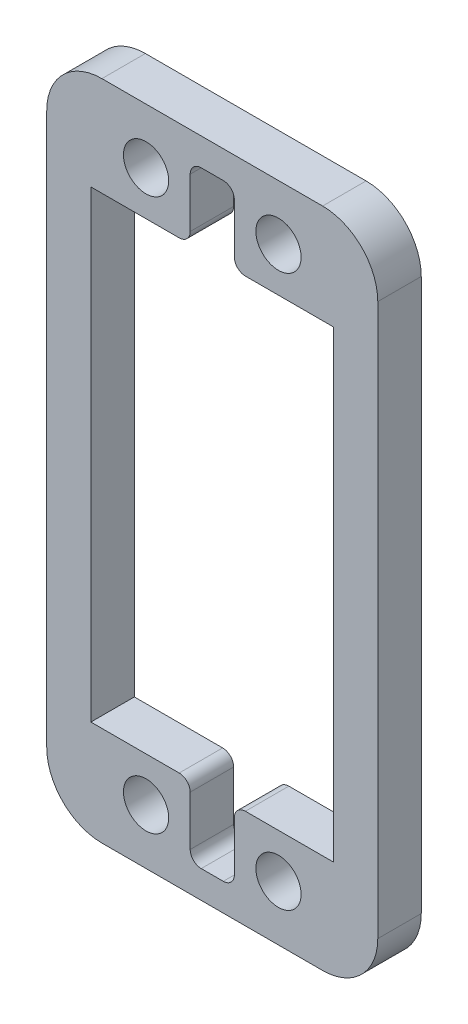
ISO-10303-21;
HEADER;
FILE_DESCRIPTION(('STEP AP214'),'2;1');
FILE_NAME('part.step','',(''),(''),'','','');
FILE_SCHEMA(('AUTOMOTIVE_DESIGN { 1 0 10303 214 1 1 1 1 }'));
ENDSEC;
DATA;
#1=APPLICATION_CONTEXT('core data for automotive mechanical design processes');
#2=APPLICATION_PROTOCOL_DEFINITION('international standard','automotive_design',2000,#1);
#3=PRODUCT_CONTEXT('',#1,'mechanical');
#4=PRODUCT('Part','Part','',(#3));
#5=PRODUCT_RELATED_PRODUCT_CATEGORY('part','',(#4));
#6=PRODUCT_DEFINITION_FORMATION('','',#4);
#7=PRODUCT_DEFINITION_CONTEXT('part definition',#1,'design');
#8=PRODUCT_DEFINITION('design','',#6,#7);
#9=PRODUCT_DEFINITION_SHAPE('','',#8);
#10=(LENGTH_UNIT() NAMED_UNIT(*) SI_UNIT(.MILLI.,.METRE.));
#11=(NAMED_UNIT(*) PLANE_ANGLE_UNIT() SI_UNIT($,.RADIAN.));
#12=(NAMED_UNIT(*) SI_UNIT($,.STERADIAN.) SOLID_ANGLE_UNIT());
#13=UNCERTAINTY_MEASURE_WITH_UNIT(LENGTH_MEASURE(1.E-05),#10,'distance_accuracy_value','');
#14=(GEOMETRIC_REPRESENTATION_CONTEXT(3) GLOBAL_UNCERTAINTY_ASSIGNED_CONTEXT((#13)) GLOBAL_UNIT_ASSIGNED_CONTEXT((#10,
#11,#12)) REPRESENTATION_CONTEXT('',''));
#15=CARTESIAN_POINT('',(0.,0.,0.));
#16=DIRECTION('',(0.,0.,1.));
#17=DIRECTION('',(1.,0.,0.));
#18=AXIS2_PLACEMENT_3D('',#15,#16,#17);
#19=CARTESIAN_POINT('',(11.,21.,3.94));
#20=DIRECTION('',(0.,1.,0.));
#21=DIRECTION('',(0.,0.,1.));
#22=AXIS2_PLACEMENT_3D('',#19,#20,#21);
#23=PLANE('',#22);
#24=DIRECTION('',(1.,0.,0.));
#25=VECTOR('',#24,1.);
#26=CARTESIAN_POINT('',(11.,21.,0.));
#27=LINE('',#26,#25);
#28=CARTESIAN_POINT('',(-11.,21.,0.));
#29=VERTEX_POINT('',#28);
#30=CARTESIAN_POINT('',(-3.,21.,0.));
#31=VERTEX_POINT('',#30);
#32=EDGE_CURVE('E252',#29,#31,#27,.T.);
#33=ORIENTED_EDGE('',*,*,#32,.T.);
#34=DIRECTION('',(0.,0.,1.));
#35=VECTOR('',#34,1.);
#36=CARTESIAN_POINT('',(-3.,21.,3.94));
#37=LINE('',#36,#35);
#38=CARTESIAN_POINT('',(-3.,21.,3.94));
#39=VERTEX_POINT('',#38);
#40=EDGE_CURVE('E388',#31,#39,#37,.T.);
#41=ORIENTED_EDGE('',*,*,#40,.T.);
#42=DIRECTION('',(1.,0.,0.));
#43=VECTOR('',#42,1.);
#44=CARTESIAN_POINT('',(11.,21.,3.94));
#45=LINE('',#44,#43);
#46=CARTESIAN_POINT('',(-11.,21.,3.94));
#47=VERTEX_POINT('',#46);
#48=EDGE_CURVE('E236',#47,#39,#45,.T.);
#49=ORIENTED_EDGE('',*,*,#48,.F.);
#50=DIRECTION('',(0.,0.,-1.));
#51=VECTOR('',#50,1.);
#52=CARTESIAN_POINT('',(-11.,21.,3.94));
#53=LINE('',#52,#51);
#54=EDGE_CURVE('E276',#47,#29,#53,.T.);
#55=ORIENTED_EDGE('',*,*,#54,.T.);
#56=EDGE_LOOP('',(#33,#41,#49,#55));
#57=FACE_BOUND('',#56,.T.);
#58=ADVANCED_FACE('F39',(#57),#23,.F.);
#59=CARTESIAN_POINT('',(-11.,-21.,3.94));
#60=DIRECTION('',(0.,-1.,0.));
#61=DIRECTION('',(0.,0.,-1.));
#62=AXIS2_PLACEMENT_3D('',#59,#60,#61);
#63=PLANE('',#62);
#64=DIRECTION('',(-1.,0.,0.));
#65=VECTOR('',#64,1.);
#66=CARTESIAN_POINT('',(-11.,-21.,3.94));
#67=LINE('',#66,#65);
#68=CARTESIAN_POINT('',(-3.00000000000001,-21.,3.94));
#69=VERTEX_POINT('',#68);
#70=CARTESIAN_POINT('',(-11.,-21.,3.94));
#71=VERTEX_POINT('',#70);
#72=EDGE_CURVE('E244',#69,#71,#67,.T.);
#73=ORIENTED_EDGE('',*,*,#72,.F.);
#74=DIRECTION('',(0.,0.,-1.));
#75=VECTOR('',#74,1.);
#76=CARTESIAN_POINT('',(-3.00000000000001,-21.,3.94));
#77=LINE('',#76,#75);
#78=CARTESIAN_POINT('',(-3.00000000000001,-21.,0.));
#79=VERTEX_POINT('',#78);
#80=EDGE_CURVE('E349',#69,#79,#77,.T.);
#81=ORIENTED_EDGE('',*,*,#80,.T.);
#82=DIRECTION('',(-1.,0.,0.));
#83=VECTOR('',#82,1.);
#84=CARTESIAN_POINT('',(-11.,-21.,0.));
#85=LINE('',#84,#83);
#86=CARTESIAN_POINT('',(-11.,-21.,0.));
#87=VERTEX_POINT('',#86);
#88=EDGE_CURVE('E266',#79,#87,#85,.T.);
#89=ORIENTED_EDGE('',*,*,#88,.T.);
#90=DIRECTION('',(0.,0.,-1.));
#91=VECTOR('',#90,1.);
#92=CARTESIAN_POINT('',(-11.,-21.,3.94));
#93=LINE('',#92,#91);
#94=EDGE_CURVE('E235',#71,#87,#93,.T.);
#95=ORIENTED_EDGE('',*,*,#94,.F.);
#96=EDGE_LOOP('',(#73,#81,#89,#95));
#97=FACE_BOUND('',#96,.T.);
#98=ADVANCED_FACE('F515',(#97),#63,.F.);
#99=CARTESIAN_POINT('',(-15.,-30.,3.94));
#100=DIRECTION('',(1.,0.,0.));
#101=DIRECTION('',(0.,0.,-1.));
#102=AXIS2_PLACEMENT_3D('',#99,#100,#101);
#103=PLANE('',#102);
#104=DIRECTION('',(0.,-1.,0.));
#105=VECTOR('',#104,1.);
#106=CARTESIAN_POINT('',(-15.,-30.,0.));
#107=LINE('',#106,#105);
#108=CARTESIAN_POINT('',(-15.,25.,0.));
#109=VERTEX_POINT('',#108);
#110=CARTESIAN_POINT('',(-15.,-25.,0.));
#111=VERTEX_POINT('',#110);
#112=EDGE_CURVE('E275',#109,#111,#107,.T.);
#113=ORIENTED_EDGE('',*,*,#112,.T.);
#114=DIRECTION('',(0.,0.,-1.));
#115=VECTOR('',#114,1.);
#116=CARTESIAN_POINT('',(-15.,-25.,3.94));
#117=LINE('',#116,#115);
#118=CARTESIAN_POINT('',(-15.,-25.,3.94));
#119=VERTEX_POINT('',#118);
#120=EDGE_CURVE('E319',#111,#119,#117,.F.);
#121=ORIENTED_EDGE('',*,*,#120,.T.);
#122=DIRECTION('',(0.,-1.,0.));
#123=VECTOR('',#122,1.);
#124=CARTESIAN_POINT('',(-15.,-30.,3.94));
#125=LINE('',#124,#123);
#126=CARTESIAN_POINT('',(-15.,25.,3.94));
#127=VERTEX_POINT('',#126);
#128=EDGE_CURVE('E280',#127,#119,#125,.T.);
#129=ORIENTED_EDGE('',*,*,#128,.F.);
#130=DIRECTION('',(0.,0.,-1.));
#131=VECTOR('',#130,1.);
#132=CARTESIAN_POINT('',(-15.,25.,3.94));
#133=LINE('',#132,#131);
#134=EDGE_CURVE('E316',#127,#109,#133,.T.);
#135=ORIENTED_EDGE('',*,*,#134,.T.);
#136=EDGE_LOOP('',(#113,#121,#129,#135));
#137=FACE_BOUND('',#136,.T.);
#138=ADVANCED_FACE('F497',(#137),#103,.F.);
#139=CARTESIAN_POINT('',(15.,-30.,3.94));
#140=DIRECTION('',(0.,1.,0.));
#141=DIRECTION('',(0.,0.,1.));
#142=AXIS2_PLACEMENT_3D('',#139,#140,#141);
#143=PLANE('',#142);
#144=DIRECTION('',(1.,0.,0.));
#145=VECTOR('',#144,1.);
#146=CARTESIAN_POINT('',(15.,-30.,3.94));
#147=LINE('',#146,#145);
#148=CARTESIAN_POINT('',(-10.,-30.,3.94));
#149=VERTEX_POINT('',#148);
#150=CARTESIAN_POINT('',(10.,-30.,3.94));
#151=VERTEX_POINT('',#150);
#152=EDGE_CURVE('E283',#149,#151,#147,.T.);
#153=ORIENTED_EDGE('',*,*,#152,.F.);
#154=DIRECTION('',(0.,0.,-1.));
#155=VECTOR('',#154,1.);
#156=CARTESIAN_POINT('',(-10.,-30.,3.94));
#157=LINE('',#156,#155);
#158=CARTESIAN_POINT('',(-10.,-30.,0.));
#159=VERTEX_POINT('',#158);
#160=EDGE_CURVE('E305',#149,#159,#157,.T.);
#161=ORIENTED_EDGE('',*,*,#160,.T.);
#162=DIRECTION('',(1.,0.,0.));
#163=VECTOR('',#162,1.);
#164=CARTESIAN_POINT('',(15.,-30.,0.));
#165=LINE('',#164,#163);
#166=CARTESIAN_POINT('',(10.,-30.,0.));
#167=VERTEX_POINT('',#166);
#168=EDGE_CURVE('E296',#159,#167,#165,.T.);
#169=ORIENTED_EDGE('',*,*,#168,.T.);
#170=DIRECTION('',(0.,0.,-1.));
#171=VECTOR('',#170,1.);
#172=CARTESIAN_POINT('',(10.,-30.,3.94));
#173=LINE('',#172,#171);
#174=EDGE_CURVE('E293',#167,#151,#173,.F.);
#175=ORIENTED_EDGE('',*,*,#174,.T.);
#176=EDGE_LOOP('',(#153,#161,#169,#175));
#177=FACE_BOUND('',#176,.T.);
#178=ADVANCED_FACE('F470',(#177),#143,.F.);
#179=CARTESIAN_POINT('',(15.,30.,3.94));
#180=DIRECTION('',(-1.,0.,0.));
#181=DIRECTION('',(0.,-1.,0.));
#182=AXIS2_PLACEMENT_3D('',#179,#180,#181);
#183=PLANE('',#182);
#184=DIRECTION('',(0.,1.,0.));
#185=VECTOR('',#184,1.);
#186=CARTESIAN_POINT('',(15.,30.,3.94));
#187=LINE('',#186,#185);
#188=CARTESIAN_POINT('',(15.,-25.,3.94));
#189=VERTEX_POINT('',#188);
#190=CARTESIAN_POINT('',(15.,25.,3.94));
#191=VERTEX_POINT('',#190);
#192=EDGE_CURVE('E287',#189,#191,#187,.T.);
#193=ORIENTED_EDGE('',*,*,#192,.F.);
#194=DIRECTION('',(0.,0.,-1.));
#195=VECTOR('',#194,1.);
#196=CARTESIAN_POINT('',(15.,-25.,3.94));
#197=LINE('',#196,#195);
#198=CARTESIAN_POINT('',(15.,-25.,0.));
#199=VERTEX_POINT('',#198);
#200=EDGE_CURVE('E331',#189,#199,#197,.T.);
#201=ORIENTED_EDGE('',*,*,#200,.T.);
#202=DIRECTION('',(0.,1.,0.));
#203=VECTOR('',#202,1.);
#204=CARTESIAN_POINT('',(15.,30.,0.));
#205=LINE('',#204,#203);
#206=CARTESIAN_POINT('',(15.,25.,0.));
#207=VERTEX_POINT('',#206);
#208=EDGE_CURVE('E299',#199,#207,#205,.T.);
#209=ORIENTED_EDGE('',*,*,#208,.T.);
#210=DIRECTION('',(0.,0.,-1.));
#211=VECTOR('',#210,1.);
#212=CARTESIAN_POINT('',(15.,25.,3.94));
#213=LINE('',#212,#211);
#214=EDGE_CURVE('E329',#207,#191,#213,.F.);
#215=ORIENTED_EDGE('',*,*,#214,.T.);
#216=EDGE_LOOP('',(#193,#201,#209,#215));
#217=FACE_BOUND('',#216,.T.);
#218=ADVANCED_FACE('F480',(#217),#183,.F.);
#219=CARTESIAN_POINT('',(-15.,30.,3.94));
#220=DIRECTION('',(0.,-1.,0.));
#221=DIRECTION('',(0.,0.,-1.));
#222=AXIS2_PLACEMENT_3D('',#219,#220,#221);
#223=PLANE('',#222);
#224=DIRECTION('',(-1.,0.,0.));
#225=VECTOR('',#224,1.);
#226=CARTESIAN_POINT('',(-15.,30.,3.94));
#227=LINE('',#226,#225);
#228=CARTESIAN_POINT('',(9.99999999999999,30.,3.94));
#229=VERTEX_POINT('',#228);
#230=CARTESIAN_POINT('',(-10.,30.,3.94));
#231=VERTEX_POINT('',#230);
#232=EDGE_CURVE('E290',#229,#231,#227,.T.);
#233=ORIENTED_EDGE('',*,*,#232,.F.);
#234=DIRECTION('',(0.,0.,-1.));
#235=VECTOR('',#234,1.);
#236=CARTESIAN_POINT('',(10.,30.,3.94));
#237=LINE('',#236,#235);
#238=CARTESIAN_POINT('',(9.99999999999999,30.,0.));
#239=VERTEX_POINT('',#238);
#240=EDGE_CURVE('E336',#229,#239,#237,.T.);
#241=ORIENTED_EDGE('',*,*,#240,.T.);
#242=DIRECTION('',(-1.,0.,0.));
#243=VECTOR('',#242,1.);
#244=CARTESIAN_POINT('',(-15.,30.,0.));
#245=LINE('',#244,#243);
#246=CARTESIAN_POINT('',(-10.,30.,0.));
#247=VERTEX_POINT('',#246);
#248=EDGE_CURVE('E284',#239,#247,#245,.T.);
#249=ORIENTED_EDGE('',*,*,#248,.T.);
#250=DIRECTION('',(0.,0.,-1.));
#251=VECTOR('',#250,1.);
#252=CARTESIAN_POINT('',(-10.,30.,3.94));
#253=LINE('',#252,#251);
#254=EDGE_CURVE('E334',#247,#231,#253,.F.);
#255=ORIENTED_EDGE('',*,*,#254,.T.);
#256=EDGE_LOOP('',(#233,#241,#249,#255));
#257=FACE_BOUND('',#256,.T.);
#258=ADVANCED_FACE('F488',(#257),#223,.F.);
#259=CARTESIAN_POINT('',(0.,0.,3.94));
#260=DIRECTION('',(0.,0.,-1.));
#261=DIRECTION('',(-1.,0.,0.));
#262=AXIS2_PLACEMENT_3D('',#259,#260,#261);
#263=PLANE('',#262);
#264=CARTESIAN_POINT('',(-6.,25.,3.94));
#265=DIRECTION('',(0.,0.,-1.));
#266=DIRECTION('',(-1.,0.,0.));
#267=AXIS2_PLACEMENT_3D('',#264,#265,#266);
#268=CIRCLE('',#267,2.05);
#269=CARTESIAN_POINT('',(-8.05,25.,3.94));
#270=VERTEX_POINT('',#269);
#271=EDGE_CURVE('E445',#270,#270,#268,.T.);
#272=ORIENTED_EDGE('',*,*,#271,.T.);
#273=EDGE_LOOP('',(#272));
#274=FACE_BOUND('',#273,.T.);
#275=CARTESIAN_POINT('',(6.,-25.,3.94));
#276=DIRECTION('',(0.,0.,-1.));
#277=DIRECTION('',(-1.,0.,0.));
#278=AXIS2_PLACEMENT_3D('',#275,#276,#277);
#279=CIRCLE('',#278,2.05);
#280=CARTESIAN_POINT('',(3.95,-25.,3.94));
#281=VERTEX_POINT('',#280);
#282=EDGE_CURVE('E451',#281,#281,#279,.T.);
#283=ORIENTED_EDGE('',*,*,#282,.T.);
#284=EDGE_LOOP('',(#283));
#285=FACE_BOUND('',#284,.T.);
#286=CARTESIAN_POINT('',(-6.,-25.,3.94));
#287=DIRECTION('',(0.,0.,-1.));
#288=DIRECTION('',(-1.,0.,0.));
#289=AXIS2_PLACEMENT_3D('',#286,#287,#288);
#290=CIRCLE('',#289,2.05);
#291=CARTESIAN_POINT('',(-8.05,-25.,3.94));
#292=VERTEX_POINT('',#291);
#293=EDGE_CURVE('E849',#292,#292,#290,.T.);
#294=ORIENTED_EDGE('',*,*,#293,.T.);
#295=EDGE_LOOP('',(#294));
#296=FACE_BOUND('',#295,.T.);
#297=DIRECTION('',(0.,1.,0.));
#298=VECTOR('',#297,1.);
#299=CARTESIAN_POINT('',(-2.,27.5,3.94));
#300=LINE('',#299,#298);
#301=CARTESIAN_POINT('',(-2.00000000000001,-26.5,3.94));
#302=VERTEX_POINT('',#301);
#303=CARTESIAN_POINT('',(-2.00000000000001,-22.,3.94));
#304=VERTEX_POINT('',#303);
#305=EDGE_CURVE('E435',#302,#304,#300,.T.);
#306=ORIENTED_EDGE('',*,*,#305,.T.);
#307=CARTESIAN_POINT('',(-3.00000000000001,-22.,3.94));
#308=DIRECTION('',(0.,0.,-1.));
#309=DIRECTION('',(-1.,0.,0.));
#310=AXIS2_PLACEMENT_3D('',#307,#308,#309);
#311=CIRCLE('',#310,1.);
#312=EDGE_CURVE('E365',#304,#69,#311,.F.);
#313=ORIENTED_EDGE('',*,*,#312,.T.);
#314=ORIENTED_EDGE('',*,*,#72,.T.);
#315=DIRECTION('',(0.,1.,0.));
#316=VECTOR('',#315,1.);
#317=CARTESIAN_POINT('',(-11.,21.,3.94));
#318=LINE('',#317,#316);
#319=EDGE_CURVE('E243',#71,#47,#318,.T.);
#320=ORIENTED_EDGE('',*,*,#319,.T.);
#321=ORIENTED_EDGE('',*,*,#48,.T.);
#322=CARTESIAN_POINT('',(-3.,22.,3.94));
#323=DIRECTION('',(0.,0.,-1.));
#324=DIRECTION('',(-1.,0.,0.));
#325=AXIS2_PLACEMENT_3D('',#322,#323,#324);
#326=CIRCLE('',#325,1.);
#327=CARTESIAN_POINT('',(-2.,22.,3.94));
#328=VERTEX_POINT('',#327);
#329=EDGE_CURVE('E360',#39,#328,#326,.F.);
#330=ORIENTED_EDGE('',*,*,#329,.T.);
#331=CARTESIAN_POINT('',(-2.,26.5,3.94));
#332=VERTEX_POINT('',#331);
#333=EDGE_CURVE('E429',#328,#332,#300,.T.);
#334=ORIENTED_EDGE('',*,*,#333,.T.);
#335=CARTESIAN_POINT('',(-1.,26.5,3.94));
#336=DIRECTION('',(0.,0.,-1.));
#337=DIRECTION('',(-1.,0.,0.));
#338=AXIS2_PLACEMENT_3D('',#335,#336,#337);
#339=CIRCLE('',#338,1.);
#340=CARTESIAN_POINT('',(-1.,27.5,3.94));
#341=VERTEX_POINT('',#340);
#342=EDGE_CURVE('E11',#332,#341,#339,.T.);
#343=ORIENTED_EDGE('',*,*,#342,.T.);
#344=DIRECTION('',(1.,0.,0.));
#345=VECTOR('',#344,1.);
#346=CARTESIAN_POINT('',(2.,27.5,3.94));
#347=LINE('',#346,#345);
#348=CARTESIAN_POINT('',(1.,27.5,3.94));
#349=VERTEX_POINT('',#348);
#350=EDGE_CURVE('E427',#341,#349,#347,.T.);
#351=ORIENTED_EDGE('',*,*,#350,.T.);
#352=CARTESIAN_POINT('',(1.,26.5,3.94));
#353=DIRECTION('',(0.,0.,-1.));
#354=DIRECTION('',(-1.,0.,0.));
#355=AXIS2_PLACEMENT_3D('',#352,#353,#354);
#356=CIRCLE('',#355,1.);
#357=CARTESIAN_POINT('',(2.,26.5,3.94));
#358=VERTEX_POINT('',#357);
#359=EDGE_CURVE('E401',#349,#358,#356,.T.);
#360=ORIENTED_EDGE('',*,*,#359,.T.);
#361=DIRECTION('',(0.,-1.,0.));
#362=VECTOR('',#361,1.);
#363=CARTESIAN_POINT('',(2.,21.,3.94));
#364=LINE('',#363,#362);
#365=CARTESIAN_POINT('',(2.,22.,3.94));
#366=VERTEX_POINT('',#365);
#367=EDGE_CURVE('E433',#358,#366,#364,.T.);
#368=ORIENTED_EDGE('',*,*,#367,.T.);
#369=CARTESIAN_POINT('',(3.,22.,3.94));
#370=DIRECTION('',(0.,0.,-1.));
#371=DIRECTION('',(-1.,0.,0.));
#372=AXIS2_PLACEMENT_3D('',#369,#370,#371);
#373=CIRCLE('',#372,1.);
#374=CARTESIAN_POINT('',(3.,21.,3.94));
#375=VERTEX_POINT('',#374);
#376=EDGE_CURVE('E362',#366,#375,#373,.F.);
#377=ORIENTED_EDGE('',*,*,#376,.T.);
#378=CARTESIAN_POINT('',(11.,21.,3.94));
#379=VERTEX_POINT('',#378);
#380=EDGE_CURVE('E250',#375,#379,#45,.T.);
#381=ORIENTED_EDGE('',*,*,#380,.T.);
#382=DIRECTION('',(0.,-1.,0.));
#383=VECTOR('',#382,1.);
#384=CARTESIAN_POINT('',(11.,-21.,3.94));
#385=LINE('',#384,#383);
#386=CARTESIAN_POINT('',(11.,-21.,3.94));
#387=VERTEX_POINT('',#386);
#388=EDGE_CURVE('E229',#379,#387,#385,.T.);
#389=ORIENTED_EDGE('',*,*,#388,.T.);
#390=CARTESIAN_POINT('',(2.99999999999999,-21.,3.94));
#391=VERTEX_POINT('',#390);
#392=EDGE_CURVE('E239',#387,#391,#67,.T.);
#393=ORIENTED_EDGE('',*,*,#392,.T.);
#394=CARTESIAN_POINT('',(2.99999999999999,-22.,3.94));
#395=DIRECTION('',(0.,0.,-1.));
#396=DIRECTION('',(-1.,0.,0.));
#397=AXIS2_PLACEMENT_3D('',#394,#395,#396);
#398=CIRCLE('',#397,1.);
#399=CARTESIAN_POINT('',(2.,-22.,3.94));
#400=VERTEX_POINT('',#399);
#401=EDGE_CURVE('E61',#391,#400,#398,.F.);
#402=ORIENTED_EDGE('',*,*,#401,.T.);
#403=CARTESIAN_POINT('',(2.,-26.5,3.94));
#404=VERTEX_POINT('',#403);
#405=EDGE_CURVE('E438',#400,#404,#364,.T.);
#406=ORIENTED_EDGE('',*,*,#405,.T.);
#407=CARTESIAN_POINT('',(0.999999999999993,-26.5,3.94));
#408=DIRECTION('',(0.,0.,-1.));
#409=DIRECTION('',(-1.,0.,0.));
#410=AXIS2_PLACEMENT_3D('',#407,#408,#409);
#411=CIRCLE('',#410,1.);
#412=CARTESIAN_POINT('',(0.999999999999993,-27.5,3.94));
#413=VERTEX_POINT('',#412);
#414=EDGE_CURVE('E397',#404,#413,#411,.T.);
#415=ORIENTED_EDGE('',*,*,#414,.T.);
#416=DIRECTION('',(-1.,0.,0.));
#417=VECTOR('',#416,1.);
#418=CARTESIAN_POINT('',(-2.00000000000001,-27.5,3.94));
#419=LINE('',#418,#417);
#420=CARTESIAN_POINT('',(-1.00000000000001,-27.5,3.94));
#421=VERTEX_POINT('',#420);
#422=EDGE_CURVE('E556',#413,#421,#419,.T.);
#423=ORIENTED_EDGE('',*,*,#422,.T.);
#424=CARTESIAN_POINT('',(-1.00000000000001,-26.5,3.94));
#425=DIRECTION('',(0.,0.,-1.));
#426=DIRECTION('',(-1.,0.,0.));
#427=AXIS2_PLACEMENT_3D('',#424,#425,#426);
#428=CIRCLE('',#427,1.);
#429=EDGE_CURVE('E393',#421,#302,#428,.T.);
#430=ORIENTED_EDGE('',*,*,#429,.T.);
#431=EDGE_LOOP('',(#306,#313,#314,#320,#321,#330,#334,#343,#351,#360,#368,#377,#381,#389,#393,
#402,#406,#415,#423,#430));
#432=FACE_BOUND('',#431,.T.);
#433=CARTESIAN_POINT('',(6.,25.,3.94));
#434=DIRECTION('',(0.,0.,-1.));
#435=DIRECTION('',(-1.,0.,0.));
#436=AXIS2_PLACEMENT_3D('',#433,#434,#435);
#437=CIRCLE('',#436,2.05);
#438=CARTESIAN_POINT('',(3.95,25.,3.94));
#439=VERTEX_POINT('',#438);
#440=EDGE_CURVE('E267',#439,#439,#437,.T.);
#441=ORIENTED_EDGE('',*,*,#440,.T.);
#442=EDGE_LOOP('',(#441));
#443=FACE_BOUND('',#442,.T.);
#444=ORIENTED_EDGE('',*,*,#128,.T.);
#445=CARTESIAN_POINT('',(-10.,-25.,3.94));
#446=DIRECTION('',(0.,0.,-1.));
#447=DIRECTION('',(-1.,0.,0.));
#448=AXIS2_PLACEMENT_3D('',#445,#446,#447);
#449=CIRCLE('',#448,5.);
#450=EDGE_CURVE('E327',#119,#149,#449,.F.);
#451=ORIENTED_EDGE('',*,*,#450,.T.);
#452=ORIENTED_EDGE('',*,*,#152,.T.);
#453=CARTESIAN_POINT('',(10.,-25.,3.94));
#454=DIRECTION('',(0.,0.,-1.));
#455=DIRECTION('',(-1.,0.,0.));
#456=AXIS2_PLACEMENT_3D('',#453,#454,#455);
#457=CIRCLE('',#456,5.);
#458=EDGE_CURVE('E325',#151,#189,#457,.F.);
#459=ORIENTED_EDGE('',*,*,#458,.T.);
#460=ORIENTED_EDGE('',*,*,#192,.T.);
#461=CARTESIAN_POINT('',(10.,25.,3.94));
#462=DIRECTION('',(0.,0.,-1.));
#463=DIRECTION('',(-1.,0.,0.));
#464=AXIS2_PLACEMENT_3D('',#461,#462,#463);
#465=CIRCLE('',#464,5.);
#466=EDGE_CURVE('E323',#191,#229,#465,.F.);
#467=ORIENTED_EDGE('',*,*,#466,.T.);
#468=ORIENTED_EDGE('',*,*,#232,.T.);
#469=CARTESIAN_POINT('',(-10.,25.,3.94));
#470=DIRECTION('',(0.,0.,-1.));
#471=DIRECTION('',(-1.,0.,0.));
#472=AXIS2_PLACEMENT_3D('',#469,#470,#471);
#473=CIRCLE('',#472,5.);
#474=EDGE_CURVE('E321',#231,#127,#473,.F.);
#475=ORIENTED_EDGE('',*,*,#474,.T.);
#476=EDGE_LOOP('',(#444,#451,#452,#459,#460,#467,#468,#475));
#477=FACE_BOUND('',#476,.T.);
#478=ADVANCED_FACE('F247',(#274,#285,#296,#432,#443,#477),#263,.F.);
#479=CARTESIAN_POINT('',(0.,0.,0.));
#480=DIRECTION('',(0.,0.,-1.));
#481=DIRECTION('',(-1.,0.,0.));
#482=AXIS2_PLACEMENT_3D('',#479,#480,#481);
#483=PLANE('',#482);
#484=CARTESIAN_POINT('',(-6.,25.,0.));
#485=DIRECTION('',(0.,0.,-1.));
#486=DIRECTION('',(-1.,0.,0.));
#487=AXIS2_PLACEMENT_3D('',#484,#485,#486);
#488=CIRCLE('',#487,2.05);
#489=CARTESIAN_POINT('',(-8.05,25.,0.));
#490=VERTEX_POINT('',#489);
#491=EDGE_CURVE('E442',#490,#490,#488,.T.);
#492=ORIENTED_EDGE('',*,*,#491,.F.);
#493=EDGE_LOOP('',(#492));
#494=FACE_BOUND('',#493,.T.);
#495=CARTESIAN_POINT('',(6.,-25.,0.));
#496=DIRECTION('',(0.,0.,-1.));
#497=DIRECTION('',(-1.,0.,0.));
#498=AXIS2_PLACEMENT_3D('',#495,#496,#497);
#499=CIRCLE('',#498,2.05);
#500=CARTESIAN_POINT('',(3.95,-25.,0.));
#501=VERTEX_POINT('',#500);
#502=EDGE_CURVE('E448',#501,#501,#499,.T.);
#503=ORIENTED_EDGE('',*,*,#502,.F.);
#504=EDGE_LOOP('',(#503));
#505=FACE_BOUND('',#504,.T.);
#506=CARTESIAN_POINT('',(-6.,-25.,0.));
#507=DIRECTION('',(0.,0.,-1.));
#508=DIRECTION('',(-1.,0.,0.));
#509=AXIS2_PLACEMENT_3D('',#506,#507,#508);
#510=CIRCLE('',#509,2.05);
#511=CARTESIAN_POINT('',(-8.05,-25.,0.));
#512=VERTEX_POINT('',#511);
#513=EDGE_CURVE('E453',#512,#512,#510,.T.);
#514=ORIENTED_EDGE('',*,*,#513,.F.);
#515=EDGE_LOOP('',(#514));
#516=FACE_BOUND('',#515,.T.);
#517=ORIENTED_EDGE('',*,*,#88,.F.);
#518=CARTESIAN_POINT('',(-3.00000000000001,-22.,0.));
#519=DIRECTION('',(0.,0.,-1.));
#520=DIRECTION('',(-1.,0.,0.));
#521=AXIS2_PLACEMENT_3D('',#518,#519,#520);
#522=CIRCLE('',#521,1.);
#523=CARTESIAN_POINT('',(-2.00000000000001,-22.,0.));
#524=VERTEX_POINT('',#523);
#525=EDGE_CURVE('E358',#79,#524,#522,.T.);
#526=ORIENTED_EDGE('',*,*,#525,.T.);
#527=DIRECTION('',(0.,1.,0.));
#528=VECTOR('',#527,1.);
#529=CARTESIAN_POINT('',(-2.,27.5,0.));
#530=LINE('',#529,#528);
#531=CARTESIAN_POINT('',(-2.00000000000001,-26.5,0.));
#532=VERTEX_POINT('',#531);
#533=EDGE_CURVE('E421',#532,#524,#530,.T.);
#534=ORIENTED_EDGE('',*,*,#533,.F.);
#535=CARTESIAN_POINT('',(-1.00000000000001,-26.5,0.));
#536=DIRECTION('',(0.,0.,-1.));
#537=DIRECTION('',(-1.,0.,0.));
#538=AXIS2_PLACEMENT_3D('',#535,#536,#537);
#539=CIRCLE('',#538,1.);
#540=CARTESIAN_POINT('',(-1.00000000000001,-27.5,0.));
#541=VERTEX_POINT('',#540);
#542=EDGE_CURVE('E391',#532,#541,#539,.F.);
#543=ORIENTED_EDGE('',*,*,#542,.T.);
#544=DIRECTION('',(-1.,0.,0.));
#545=VECTOR('',#544,1.);
#546=CARTESIAN_POINT('',(-2.00000000000001,-27.5,0.));
#547=LINE('',#546,#545);
#548=CARTESIAN_POINT('',(0.999999999999993,-27.5,0.));
#549=VERTEX_POINT('',#548);
#550=EDGE_CURVE('E553',#549,#541,#547,.T.);
#551=ORIENTED_EDGE('',*,*,#550,.F.);
#552=CARTESIAN_POINT('',(0.999999999999993,-26.5,0.));
#553=DIRECTION('',(0.,0.,-1.));
#554=DIRECTION('',(-1.,0.,0.));
#555=AXIS2_PLACEMENT_3D('',#552,#553,#554);
#556=CIRCLE('',#555,1.);
#557=CARTESIAN_POINT('',(1.99999999999999,-26.5,0.));
#558=VERTEX_POINT('',#557);
#559=EDGE_CURVE('E395',#549,#558,#556,.F.);
#560=ORIENTED_EDGE('',*,*,#559,.T.);
#561=DIRECTION('',(0.,-1.,0.));
#562=VECTOR('',#561,1.);
#563=CARTESIAN_POINT('',(1.99999999999999,-27.5,0.));
#564=LINE('',#563,#562);
#565=CARTESIAN_POINT('',(1.99999999999999,-22.,0.));
#566=VERTEX_POINT('',#565);
#567=EDGE_CURVE('E550',#566,#558,#564,.T.);
#568=ORIENTED_EDGE('',*,*,#567,.F.);
#569=CARTESIAN_POINT('',(2.99999999999999,-22.,0.));
#570=DIRECTION('',(0.,0.,-1.));
#571=DIRECTION('',(-1.,0.,0.));
#572=AXIS2_PLACEMENT_3D('',#569,#570,#571);
#573=CIRCLE('',#572,1.);
#574=CARTESIAN_POINT('',(2.99999999999999,-21.,0.));
#575=VERTEX_POINT('',#574);
#576=EDGE_CURVE('E356',#566,#575,#573,.T.);
#577=ORIENTED_EDGE('',*,*,#576,.T.);
#578=CARTESIAN_POINT('',(11.,-21.,0.));
#579=VERTEX_POINT('',#578);
#580=EDGE_CURVE('E268',#579,#575,#85,.T.);
#581=ORIENTED_EDGE('',*,*,#580,.F.);
#582=DIRECTION('',(0.,-1.,0.));
#583=VECTOR('',#582,1.);
#584=CARTESIAN_POINT('',(11.,-21.,0.));
#585=LINE('',#584,#583);
#586=CARTESIAN_POINT('',(11.,21.,0.));
#587=VERTEX_POINT('',#586);
#588=EDGE_CURVE('E231',#587,#579,#585,.T.);
#589=ORIENTED_EDGE('',*,*,#588,.F.);
#590=CARTESIAN_POINT('',(3.,21.,0.));
#591=VERTEX_POINT('',#590);
#592=EDGE_CURVE('E255',#591,#587,#27,.T.);
#593=ORIENTED_EDGE('',*,*,#592,.F.);
#594=CARTESIAN_POINT('',(3.,22.,0.));
#595=DIRECTION('',(0.,0.,-1.));
#596=DIRECTION('',(-1.,0.,0.));
#597=AXIS2_PLACEMENT_3D('',#594,#595,#596);
#598=CIRCLE('',#597,1.);
#599=CARTESIAN_POINT('',(2.,22.,0.));
#600=VERTEX_POINT('',#599);
#601=EDGE_CURVE('E354',#591,#600,#598,.T.);
#602=ORIENTED_EDGE('',*,*,#601,.T.);
#603=CARTESIAN_POINT('',(2.,26.5,0.));
#604=VERTEX_POINT('',#603);
#605=EDGE_CURVE('E545',#604,#600,#564,.T.);
#606=ORIENTED_EDGE('',*,*,#605,.F.);
#607=CARTESIAN_POINT('',(1.,26.5,0.));
#608=DIRECTION('',(0.,0.,-1.));
#609=DIRECTION('',(-1.,0.,0.));
#610=AXIS2_PLACEMENT_3D('',#607,#608,#609);
#611=CIRCLE('',#610,1.);
#612=CARTESIAN_POINT('',(1.,27.5,0.));
#613=VERTEX_POINT('',#612);
#614=EDGE_CURVE('E399',#604,#613,#611,.F.);
#615=ORIENTED_EDGE('',*,*,#614,.T.);
#616=DIRECTION('',(1.,0.,0.));
#617=VECTOR('',#616,1.);
#618=CARTESIAN_POINT('',(2.,27.5,0.));
#619=LINE('',#618,#617);
#620=CARTESIAN_POINT('',(-1.,27.5,0.));
#621=VERTEX_POINT('',#620);
#622=EDGE_CURVE('E412',#621,#613,#619,.T.);
#623=ORIENTED_EDGE('',*,*,#622,.F.);
#624=CARTESIAN_POINT('',(-1.,26.5,0.));
#625=DIRECTION('',(0.,0.,-1.));
#626=DIRECTION('',(-1.,0.,0.));
#627=AXIS2_PLACEMENT_3D('',#624,#625,#626);
#628=CIRCLE('',#627,1.);
#629=CARTESIAN_POINT('',(-2.,26.5,0.));
#630=VERTEX_POINT('',#629);
#631=EDGE_CURVE('E47',#621,#630,#628,.F.);
#632=ORIENTED_EDGE('',*,*,#631,.T.);
#633=CARTESIAN_POINT('',(-2.,22.,0.));
#634=VERTEX_POINT('',#633);
#635=EDGE_CURVE('E409',#634,#630,#530,.T.);
#636=ORIENTED_EDGE('',*,*,#635,.F.);
#637=CARTESIAN_POINT('',(-3.,22.,0.));
#638=DIRECTION('',(0.,0.,-1.));
#639=DIRECTION('',(-1.,0.,0.));
#640=AXIS2_PLACEMENT_3D('',#637,#638,#639);
#641=CIRCLE('',#640,1.);
#642=EDGE_CURVE('E352',#634,#31,#641,.T.);
#643=ORIENTED_EDGE('',*,*,#642,.T.);
#644=ORIENTED_EDGE('',*,*,#32,.F.);
#645=DIRECTION('',(0.,1.,0.));
#646=VECTOR('',#645,1.);
#647=CARTESIAN_POINT('',(-11.,21.,0.));
#648=LINE('',#647,#646);
#649=EDGE_CURVE('E270',#87,#29,#648,.T.);
#650=ORIENTED_EDGE('',*,*,#649,.F.);
#651=EDGE_LOOP('',(#517,#526,#534,#543,#551,#560,#568,#577,#581,#589,#593,#602,#606,#615,#623,
#632,#636,#643,#644,#650));
#652=FACE_BOUND('',#651,.T.);
#653=CARTESIAN_POINT('',(6.,25.,0.));
#654=DIRECTION('',(0.,0.,-1.));
#655=DIRECTION('',(-1.,0.,0.));
#656=AXIS2_PLACEMENT_3D('',#653,#654,#655);
#657=CIRCLE('',#656,2.05);
#658=CARTESIAN_POINT('',(3.95,25.,0.));
#659=VERTEX_POINT('',#658);
#660=EDGE_CURVE('E258',#659,#659,#657,.T.);
#661=ORIENTED_EDGE('',*,*,#660,.F.);
#662=EDGE_LOOP('',(#661));
#663=FACE_BOUND('',#662,.T.);
#664=ORIENTED_EDGE('',*,*,#168,.F.);
#665=CARTESIAN_POINT('',(-10.,-25.,0.));
#666=DIRECTION('',(0.,0.,-1.));
#667=DIRECTION('',(-1.,0.,0.));
#668=AXIS2_PLACEMENT_3D('',#665,#666,#667);
#669=CIRCLE('',#668,5.);
#670=EDGE_CURVE('E314',#159,#111,#669,.T.);
#671=ORIENTED_EDGE('',*,*,#670,.T.);
#672=ORIENTED_EDGE('',*,*,#112,.F.);
#673=CARTESIAN_POINT('',(-10.,25.,0.));
#674=DIRECTION('',(0.,0.,-1.));
#675=DIRECTION('',(-1.,0.,0.));
#676=AXIS2_PLACEMENT_3D('',#673,#674,#675);
#677=CIRCLE('',#676,5.);
#678=EDGE_CURVE('E308',#109,#247,#677,.T.);
#679=ORIENTED_EDGE('',*,*,#678,.T.);
#680=ORIENTED_EDGE('',*,*,#248,.F.);
#681=CARTESIAN_POINT('',(10.,25.,0.));
#682=DIRECTION('',(0.,0.,-1.));
#683=DIRECTION('',(-1.,0.,0.));
#684=AXIS2_PLACEMENT_3D('',#681,#682,#683);
#685=CIRCLE('',#684,5.);
#686=EDGE_CURVE('E310',#239,#207,#685,.T.);
#687=ORIENTED_EDGE('',*,*,#686,.T.);
#688=ORIENTED_EDGE('',*,*,#208,.F.);
#689=CARTESIAN_POINT('',(10.,-25.,0.));
#690=DIRECTION('',(0.,0.,-1.));
#691=DIRECTION('',(-1.,0.,0.));
#692=AXIS2_PLACEMENT_3D('',#689,#690,#691);
#693=CIRCLE('',#692,5.);
#694=EDGE_CURVE('E312',#199,#167,#693,.T.);
#695=ORIENTED_EDGE('',*,*,#694,.T.);
#696=EDGE_LOOP('',(#664,#671,#672,#679,#680,#687,#688,#695));
#697=FACE_BOUND('',#696,.T.);
#698=ADVANCED_FACE('F407',(#494,#505,#516,#652,#663,#697),#483,.T.);
#699=CARTESIAN_POINT('',(11.,-21.,3.94));
#700=DIRECTION('',(1.,0.,0.));
#701=DIRECTION('',(0.,0.,-1.));
#702=AXIS2_PLACEMENT_3D('',#699,#700,#701);
#703=PLANE('',#702);
#704=ORIENTED_EDGE('',*,*,#588,.T.);
#705=DIRECTION('',(0.,0.,-1.));
#706=VECTOR('',#705,1.);
#707=CARTESIAN_POINT('',(11.,-21.,3.94));
#708=LINE('',#707,#706);
#709=EDGE_CURVE('E224',#387,#579,#708,.T.);
#710=ORIENTED_EDGE('',*,*,#709,.F.);
#711=ORIENTED_EDGE('',*,*,#388,.F.);
#712=DIRECTION('',(0.,0.,-1.));
#713=VECTOR('',#712,1.);
#714=CARTESIAN_POINT('',(11.,21.,3.94));
#715=LINE('',#714,#713);
#716=EDGE_CURVE('E273',#379,#587,#715,.T.);
#717=ORIENTED_EDGE('',*,*,#716,.T.);
#718=EDGE_LOOP('',(#704,#710,#711,#717));
#719=FACE_BOUND('',#718,.T.);
#720=ADVANCED_FACE('F226',(#719),#703,.F.);
#721=ORIENTED_EDGE('',*,*,#380,.F.);
#722=DIRECTION('',(0.,0.,-1.));
#723=VECTOR('',#722,1.);
#724=CARTESIAN_POINT('',(3.,21.,3.94));
#725=LINE('',#724,#723);
#726=EDGE_CURVE('E385',#375,#591,#725,.T.);
#727=ORIENTED_EDGE('',*,*,#726,.T.);
#728=ORIENTED_EDGE('',*,*,#592,.T.);
#729=ORIENTED_EDGE('',*,*,#716,.F.);
#730=EDGE_LOOP('',(#721,#727,#728,#729));
#731=FACE_BOUND('',#730,.T.);
#732=ADVANCED_FACE('F518',(#731),#23,.F.);
#733=CARTESIAN_POINT('',(-11.,21.,3.94));
#734=DIRECTION('',(-1.,0.,0.));
#735=DIRECTION('',(0.,0.,1.));
#736=AXIS2_PLACEMENT_3D('',#733,#734,#735);
#737=PLANE('',#736);
#738=ORIENTED_EDGE('',*,*,#649,.T.);
#739=ORIENTED_EDGE('',*,*,#54,.F.);
#740=ORIENTED_EDGE('',*,*,#319,.F.);
#741=ORIENTED_EDGE('',*,*,#94,.T.);
#742=EDGE_LOOP('',(#738,#739,#740,#741));
#743=FACE_BOUND('',#742,.T.);
#744=ADVANCED_FACE('F528',(#743),#737,.F.);
#745=ORIENTED_EDGE('',*,*,#580,.T.);
#746=DIRECTION('',(0.,0.,1.));
#747=VECTOR('',#746,1.);
#748=CARTESIAN_POINT('',(2.99999999999999,-21.,3.94));
#749=LINE('',#748,#747);
#750=EDGE_CURVE('E242',#575,#391,#749,.T.);
#751=ORIENTED_EDGE('',*,*,#750,.T.);
#752=ORIENTED_EDGE('',*,*,#392,.F.);
#753=ORIENTED_EDGE('',*,*,#709,.T.);
#754=EDGE_LOOP('',(#745,#751,#752,#753));
#755=FACE_BOUND('',#754,.T.);
#756=ADVANCED_FACE('F240',(#755),#63,.F.);
#757=CARTESIAN_POINT('',(-2.,27.5,3.94));
#758=DIRECTION('',(-1.,0.,0.));
#759=DIRECTION('',(0.,-1.,0.));
#760=AXIS2_PLACEMENT_3D('',#757,#758,#759);
#761=PLANE('',#760);
#762=ORIENTED_EDGE('',*,*,#305,.F.);
#763=DIRECTION('',(0.,0.,-1.));
#764=VECTOR('',#763,1.);
#765=CARTESIAN_POINT('',(-2.00000000000001,-26.5,0.));
#766=LINE('',#765,#764);
#767=EDGE_CURVE('E341',#302,#532,#766,.T.);
#768=ORIENTED_EDGE('',*,*,#767,.T.);
#769=ORIENTED_EDGE('',*,*,#533,.T.);
#770=DIRECTION('',(0.,0.,-1.));
#771=VECTOR('',#770,1.);
#772=CARTESIAN_POINT('',(-2.00000000000001,-22.,3.94));
#773=LINE('',#772,#771);
#774=EDGE_CURVE('E339',#524,#304,#773,.F.);
#775=ORIENTED_EDGE('',*,*,#774,.T.);
#776=EDGE_LOOP('',(#762,#768,#769,#775));
#777=FACE_BOUND('',#776,.T.);
#778=ADVANCED_FACE('F694',(#777),#761,.F.);
#779=CARTESIAN_POINT('',(1.99999999999999,-27.5,3.94));
#780=DIRECTION('',(1.,0.,0.));
#781=DIRECTION('',(0.,1.,0.));
#782=AXIS2_PLACEMENT_3D('',#779,#780,#781);
#783=PLANE('',#782);
#784=ORIENTED_EDGE('',*,*,#405,.F.);
#785=DIRECTION('',(0.,0.,1.));
#786=VECTOR('',#785,1.);
#787=CARTESIAN_POINT('',(1.99999999999999,-22.,3.94));
#788=LINE('',#787,#786);
#789=EDGE_CURVE('E369',#400,#566,#788,.F.);
#790=ORIENTED_EDGE('',*,*,#789,.T.);
#791=ORIENTED_EDGE('',*,*,#567,.T.);
#792=DIRECTION('',(0.,0.,-1.));
#793=VECTOR('',#792,1.);
#794=CARTESIAN_POINT('',(1.99999999999999,-26.5,3.94));
#795=LINE('',#794,#793);
#796=EDGE_CURVE('E54',#558,#404,#795,.F.);
#797=ORIENTED_EDGE('',*,*,#796,.T.);
#798=EDGE_LOOP('',(#784,#790,#791,#797));
#799=FACE_BOUND('',#798,.T.);
#800=ADVANCED_FACE('F686',(#799),#783,.F.);
#801=CARTESIAN_POINT('',(-2.00000000000001,-27.5,3.94));
#802=DIRECTION('',(0.,-1.,0.));
#803=DIRECTION('',(0.,0.,-1.));
#804=AXIS2_PLACEMENT_3D('',#801,#802,#803);
#805=PLANE('',#804);
#806=ORIENTED_EDGE('',*,*,#550,.T.);
#807=DIRECTION('',(0.,0.,-1.));
#808=VECTOR('',#807,1.);
#809=CARTESIAN_POINT('',(-1.00000000000001,-27.5,3.94));
#810=LINE('',#809,#808);
#811=EDGE_CURVE('E347',#541,#421,#810,.F.);
#812=ORIENTED_EDGE('',*,*,#811,.T.);
#813=ORIENTED_EDGE('',*,*,#422,.F.);
#814=DIRECTION('',(0.,0.,-1.));
#815=VECTOR('',#814,1.);
#816=CARTESIAN_POINT('',(0.999999999999993,-27.5,0.));
#817=LINE('',#816,#815);
#818=EDGE_CURVE('E344',#413,#549,#817,.T.);
#819=ORIENTED_EDGE('',*,*,#818,.T.);
#820=EDGE_LOOP('',(#806,#812,#813,#819));
#821=FACE_BOUND('',#820,.T.);
#822=ADVANCED_FACE('F568',(#821),#805,.F.);
#823=ORIENTED_EDGE('',*,*,#635,.T.);
#824=DIRECTION('',(0.,0.,-1.));
#825=VECTOR('',#824,1.);
#826=CARTESIAN_POINT('',(-2.,26.5,3.94));
#827=LINE('',#826,#825);
#828=EDGE_CURVE('E383',#630,#332,#827,.F.);
#829=ORIENTED_EDGE('',*,*,#828,.T.);
#830=ORIENTED_EDGE('',*,*,#333,.F.);
#831=DIRECTION('',(0.,0.,1.));
#832=VECTOR('',#831,1.);
#833=CARTESIAN_POINT('',(-2.,22.,3.94));
#834=LINE('',#833,#832);
#835=EDGE_CURVE('E381',#328,#634,#834,.F.);
#836=ORIENTED_EDGE('',*,*,#835,.T.);
#837=EDGE_LOOP('',(#823,#829,#830,#836));
#838=FACE_BOUND('',#837,.T.);
#839=ADVANCED_FACE('F417',(#838),#761,.F.);
#840=ORIENTED_EDGE('',*,*,#367,.F.);
#841=DIRECTION('',(0.,0.,-1.));
#842=VECTOR('',#841,1.);
#843=CARTESIAN_POINT('',(2.,26.5,0.));
#844=LINE('',#843,#842);
#845=EDGE_CURVE('E373',#358,#604,#844,.T.);
#846=ORIENTED_EDGE('',*,*,#845,.T.);
#847=ORIENTED_EDGE('',*,*,#605,.T.);
#848=DIRECTION('',(0.,0.,-1.));
#849=VECTOR('',#848,1.);
#850=CARTESIAN_POINT('',(2.,22.,3.94));
#851=LINE('',#850,#849);
#852=EDGE_CURVE('E371',#600,#366,#851,.F.);
#853=ORIENTED_EDGE('',*,*,#852,.T.);
#854=EDGE_LOOP('',(#840,#846,#847,#853));
#855=FACE_BOUND('',#854,.T.);
#856=ADVANCED_FACE('F548',(#855),#783,.F.);
#857=CARTESIAN_POINT('',(2.,27.5,3.94));
#858=DIRECTION('',(0.,1.,0.));
#859=DIRECTION('',(0.,0.,1.));
#860=AXIS2_PLACEMENT_3D('',#857,#858,#859);
#861=PLANE('',#860);
#862=ORIENTED_EDGE('',*,*,#622,.T.);
#863=DIRECTION('',(0.,0.,-1.));
#864=VECTOR('',#863,1.);
#865=CARTESIAN_POINT('',(1.,27.5,3.94));
#866=LINE('',#865,#864);
#867=EDGE_CURVE('E379',#613,#349,#866,.F.);
#868=ORIENTED_EDGE('',*,*,#867,.T.);
#869=ORIENTED_EDGE('',*,*,#350,.F.);
#870=DIRECTION('',(0.,0.,-1.));
#871=VECTOR('',#870,1.);
#872=CARTESIAN_POINT('',(-1.,27.5,0.));
#873=LINE('',#872,#871);
#874=EDGE_CURVE('E376',#341,#621,#873,.T.);
#875=ORIENTED_EDGE('',*,*,#874,.T.);
#876=EDGE_LOOP('',(#862,#868,#869,#875));
#877=FACE_BOUND('',#876,.T.);
#878=ADVANCED_FACE('F431',(#877),#861,.F.);
#879=CARTESIAN_POINT('',(6.,25.,3.94));
#880=DIRECTION('',(0.,0.,-1.));
#881=DIRECTION('',(-1.,0.,0.));
#882=AXIS2_PLACEMENT_3D('',#879,#880,#881);
#883=CYLINDRICAL_SURFACE('',#882,2.05);
#884=ORIENTED_EDGE('',*,*,#440,.F.);
#885=EDGE_LOOP('',(#884));
#886=FACE_BOUND('',#885,.T.);
#887=ORIENTED_EDGE('',*,*,#660,.T.);
#888=EDGE_LOOP('',(#887));
#889=FACE_BOUND('',#888,.T.);
#890=ADVANCED_FACE('F459',(#886,#889),#883,.F.);
#891=CARTESIAN_POINT('',(-6.,-25.,3.94));
#892=DIRECTION('',(0.,0.,-1.));
#893=DIRECTION('',(-1.,0.,0.));
#894=AXIS2_PLACEMENT_3D('',#891,#892,#893);
#895=CYLINDRICAL_SURFACE('',#894,2.05);
#896=ORIENTED_EDGE('',*,*,#293,.F.);
#897=EDGE_LOOP('',(#896));
#898=FACE_BOUND('',#897,.T.);
#899=ORIENTED_EDGE('',*,*,#513,.T.);
#900=EDGE_LOOP('',(#899));
#901=FACE_BOUND('',#900,.T.);
#902=ADVANCED_FACE('F751',(#898,#901),#895,.F.);
#903=CARTESIAN_POINT('',(6.,-25.,3.94));
#904=DIRECTION('',(0.,0.,-1.));
#905=DIRECTION('',(-1.,0.,0.));
#906=AXIS2_PLACEMENT_3D('',#903,#904,#905);
#907=CYLINDRICAL_SURFACE('',#906,2.05);
#908=ORIENTED_EDGE('',*,*,#282,.F.);
#909=EDGE_LOOP('',(#908));
#910=FACE_BOUND('',#909,.T.);
#911=ORIENTED_EDGE('',*,*,#502,.T.);
#912=EDGE_LOOP('',(#911));
#913=FACE_BOUND('',#912,.T.);
#914=ADVANCED_FACE('F510',(#910,#913),#907,.F.);
#915=CARTESIAN_POINT('',(-6.,25.,3.94));
#916=DIRECTION('',(0.,0.,-1.));
#917=DIRECTION('',(-1.,0.,0.));
#918=AXIS2_PLACEMENT_3D('',#915,#916,#917);
#919=CYLINDRICAL_SURFACE('',#918,2.05);
#920=ORIENTED_EDGE('',*,*,#271,.F.);
#921=EDGE_LOOP('',(#920));
#922=FACE_BOUND('',#921,.T.);
#923=ORIENTED_EDGE('',*,*,#491,.T.);
#924=EDGE_LOOP('',(#923));
#925=FACE_BOUND('',#924,.T.);
#926=ADVANCED_FACE('F502',(#922,#925),#919,.F.);
#927=CARTESIAN_POINT('',(-10.,-25.,3.94));
#928=DIRECTION('',(0.,0.,-1.));
#929=DIRECTION('',(-1.,0.,0.));
#930=AXIS2_PLACEMENT_3D('',#927,#928,#929);
#931=CYLINDRICAL_SURFACE('',#930,5.);
#932=ORIENTED_EDGE('',*,*,#450,.F.);
#933=ORIENTED_EDGE('',*,*,#120,.F.);
#934=ORIENTED_EDGE('',*,*,#670,.F.);
#935=ORIENTED_EDGE('',*,*,#160,.F.);
#936=EDGE_LOOP('',(#932,#933,#934,#935));
#937=FACE_BOUND('',#936,.T.);
#938=ADVANCED_FACE('F500',(#937),#931,.T.);
#939=CARTESIAN_POINT('',(10.,-25.,3.94));
#940=DIRECTION('',(0.,0.,-1.));
#941=DIRECTION('',(-1.,0.,0.));
#942=AXIS2_PLACEMENT_3D('',#939,#940,#941);
#943=CYLINDRICAL_SURFACE('',#942,5.);
#944=ORIENTED_EDGE('',*,*,#458,.F.);
#945=ORIENTED_EDGE('',*,*,#174,.F.);
#946=ORIENTED_EDGE('',*,*,#694,.F.);
#947=ORIENTED_EDGE('',*,*,#200,.F.);
#948=EDGE_LOOP('',(#944,#945,#946,#947));
#949=FACE_BOUND('',#948,.T.);
#950=ADVANCED_FACE('F474',(#949),#943,.T.);
#951=CARTESIAN_POINT('',(10.,25.,3.94));
#952=DIRECTION('',(0.,0.,-1.));
#953=DIRECTION('',(-1.,0.,0.));
#954=AXIS2_PLACEMENT_3D('',#951,#952,#953);
#955=CYLINDRICAL_SURFACE('',#954,5.);
#956=ORIENTED_EDGE('',*,*,#466,.F.);
#957=ORIENTED_EDGE('',*,*,#214,.F.);
#958=ORIENTED_EDGE('',*,*,#686,.F.);
#959=ORIENTED_EDGE('',*,*,#240,.F.);
#960=EDGE_LOOP('',(#956,#957,#958,#959));
#961=FACE_BOUND('',#960,.T.);
#962=ADVANCED_FACE('F483',(#961),#955,.T.);
#963=CARTESIAN_POINT('',(-10.,25.,3.94));
#964=DIRECTION('',(0.,0.,-1.));
#965=DIRECTION('',(-1.,0.,0.));
#966=AXIS2_PLACEMENT_3D('',#963,#964,#965);
#967=CYLINDRICAL_SURFACE('',#966,5.);
#968=ORIENTED_EDGE('',*,*,#474,.F.);
#969=ORIENTED_EDGE('',*,*,#254,.F.);
#970=ORIENTED_EDGE('',*,*,#678,.F.);
#971=ORIENTED_EDGE('',*,*,#134,.F.);
#972=EDGE_LOOP('',(#968,#969,#970,#971));
#973=FACE_BOUND('',#972,.T.);
#974=ADVANCED_FACE('F492',(#973),#967,.T.);
#975=CARTESIAN_POINT('',(-1.00000000000001,-26.5,3.94));
#976=DIRECTION('',(0.,0.,1.));
#977=DIRECTION('',(1.,0.,0.));
#978=AXIS2_PLACEMENT_3D('',#975,#976,#977);
#979=CYLINDRICAL_SURFACE('',#978,1.);
#980=ORIENTED_EDGE('',*,*,#429,.F.);
#981=ORIENTED_EDGE('',*,*,#811,.F.);
#982=ORIENTED_EDGE('',*,*,#542,.F.);
#983=ORIENTED_EDGE('',*,*,#767,.F.);
#984=EDGE_LOOP('',(#980,#981,#982,#983));
#985=FACE_BOUND('',#984,.T.);
#986=ADVANCED_FACE('F610',(#985),#979,.F.);
#987=CARTESIAN_POINT('',(-3.00000000000001,-22.,3.94));
#988=DIRECTION('',(0.,0.,-1.));
#989=DIRECTION('',(-1.,0.,0.));
#990=AXIS2_PLACEMENT_3D('',#987,#988,#989);
#991=CYLINDRICAL_SURFACE('',#990,1.);
#992=ORIENTED_EDGE('',*,*,#312,.F.);
#993=ORIENTED_EDGE('',*,*,#774,.F.);
#994=ORIENTED_EDGE('',*,*,#525,.F.);
#995=ORIENTED_EDGE('',*,*,#80,.F.);
#996=EDGE_LOOP('',(#992,#993,#994,#995));
#997=FACE_BOUND('',#996,.T.);
#998=ADVANCED_FACE('F580',(#997),#991,.T.);
#999=CARTESIAN_POINT('',(2.99999999999999,-22.,3.94));
#1000=DIRECTION('',(0.,0.,1.));
#1001=DIRECTION('',(1.,0.,0.));
#1002=AXIS2_PLACEMENT_3D('',#999,#1000,#1001);
#1003=CYLINDRICAL_SURFACE('',#1002,1.);
#1004=ORIENTED_EDGE('',*,*,#576,.F.);
#1005=ORIENTED_EDGE('',*,*,#789,.F.);
#1006=ORIENTED_EDGE('',*,*,#401,.F.);
#1007=ORIENTED_EDGE('',*,*,#750,.F.);
#1008=EDGE_LOOP('',(#1004,#1005,#1006,#1007));
#1009=FACE_BOUND('',#1008,.T.);
#1010=ADVANCED_FACE('F604',(#1009),#1003,.T.);
#1011=CARTESIAN_POINT('',(0.999999999999993,-26.5,3.94));
#1012=DIRECTION('',(0.,0.,1.));
#1013=DIRECTION('',(1.,0.,0.));
#1014=AXIS2_PLACEMENT_3D('',#1011,#1012,#1013);
#1015=CYLINDRICAL_SURFACE('',#1014,1.);
#1016=ORIENTED_EDGE('',*,*,#414,.F.);
#1017=ORIENTED_EDGE('',*,*,#796,.F.);
#1018=ORIENTED_EDGE('',*,*,#559,.F.);
#1019=ORIENTED_EDGE('',*,*,#818,.F.);
#1020=EDGE_LOOP('',(#1016,#1017,#1018,#1019));
#1021=FACE_BOUND('',#1020,.T.);
#1022=ADVANCED_FACE('F564',(#1021),#1015,.F.);
#1023=CARTESIAN_POINT('',(1.,26.5,3.94));
#1024=DIRECTION('',(0.,0.,1.));
#1025=DIRECTION('',(1.,0.,0.));
#1026=AXIS2_PLACEMENT_3D('',#1023,#1024,#1025);
#1027=CYLINDRICAL_SURFACE('',#1026,1.);
#1028=ORIENTED_EDGE('',*,*,#359,.F.);
#1029=ORIENTED_EDGE('',*,*,#867,.F.);
#1030=ORIENTED_EDGE('',*,*,#614,.F.);
#1031=ORIENTED_EDGE('',*,*,#845,.F.);
#1032=EDGE_LOOP('',(#1028,#1029,#1030,#1031));
#1033=FACE_BOUND('',#1032,.T.);
#1034=ADVANCED_FACE('F596',(#1033),#1027,.F.);
#1035=CARTESIAN_POINT('',(-1.,26.5,3.94));
#1036=DIRECTION('',(0.,0.,1.));
#1037=DIRECTION('',(1.,0.,0.));
#1038=AXIS2_PLACEMENT_3D('',#1035,#1036,#1037);
#1039=CYLINDRICAL_SURFACE('',#1038,1.);
#1040=ORIENTED_EDGE('',*,*,#342,.F.);
#1041=ORIENTED_EDGE('',*,*,#828,.F.);
#1042=ORIENTED_EDGE('',*,*,#631,.F.);
#1043=ORIENTED_EDGE('',*,*,#874,.F.);
#1044=EDGE_LOOP('',(#1040,#1041,#1042,#1043));
#1045=FACE_BOUND('',#1044,.T.);
#1046=ADVANCED_FACE('F424',(#1045),#1039,.F.);
#1047=CARTESIAN_POINT('',(3.,22.,3.94));
#1048=DIRECTION('',(0.,0.,-1.));
#1049=DIRECTION('',(-1.,0.,0.));
#1050=AXIS2_PLACEMENT_3D('',#1047,#1048,#1049);
#1051=CYLINDRICAL_SURFACE('',#1050,1.);
#1052=ORIENTED_EDGE('',*,*,#376,.F.);
#1053=ORIENTED_EDGE('',*,*,#852,.F.);
#1054=ORIENTED_EDGE('',*,*,#601,.F.);
#1055=ORIENTED_EDGE('',*,*,#726,.F.);
#1056=EDGE_LOOP('',(#1052,#1053,#1054,#1055));
#1057=FACE_BOUND('',#1056,.T.);
#1058=ADVANCED_FACE('F541',(#1057),#1051,.T.);
#1059=CARTESIAN_POINT('',(-3.,22.,3.94));
#1060=DIRECTION('',(0.,0.,1.));
#1061=DIRECTION('',(1.,0.,0.));
#1062=AXIS2_PLACEMENT_3D('',#1059,#1060,#1061);
#1063=CYLINDRICAL_SURFACE('',#1062,1.);
#1064=ORIENTED_EDGE('',*,*,#642,.F.);
#1065=ORIENTED_EDGE('',*,*,#835,.F.);
#1066=ORIENTED_EDGE('',*,*,#329,.F.);
#1067=ORIENTED_EDGE('',*,*,#40,.F.);
#1068=EDGE_LOOP('',(#1064,#1065,#1066,#1067));
#1069=FACE_BOUND('',#1068,.T.);
#1070=ADVANCED_FACE('F41',(#1069),#1063,.T.);
#1071=CLOSED_SHELL('',(#58,#98,#138,#178,#218,#258,#478,#698,#720,#732,#744,#756,#778,#800,#822,
#839,#856,#878,#890,#902,#914,#926,#938,#950,#962,#974,#986,#998,#1010,#1022,#1034,#1046,#1058,#1070));
#1072=MANIFOLD_SOLID_BREP('B2',#1071);
#1073=ADVANCED_BREP_SHAPE_REPRESENTATION('',(#18,#1072),#14);
#1074=SHAPE_DEFINITION_REPRESENTATION(#9,#1073);
ENDSEC;
END-ISO-10303-21;
